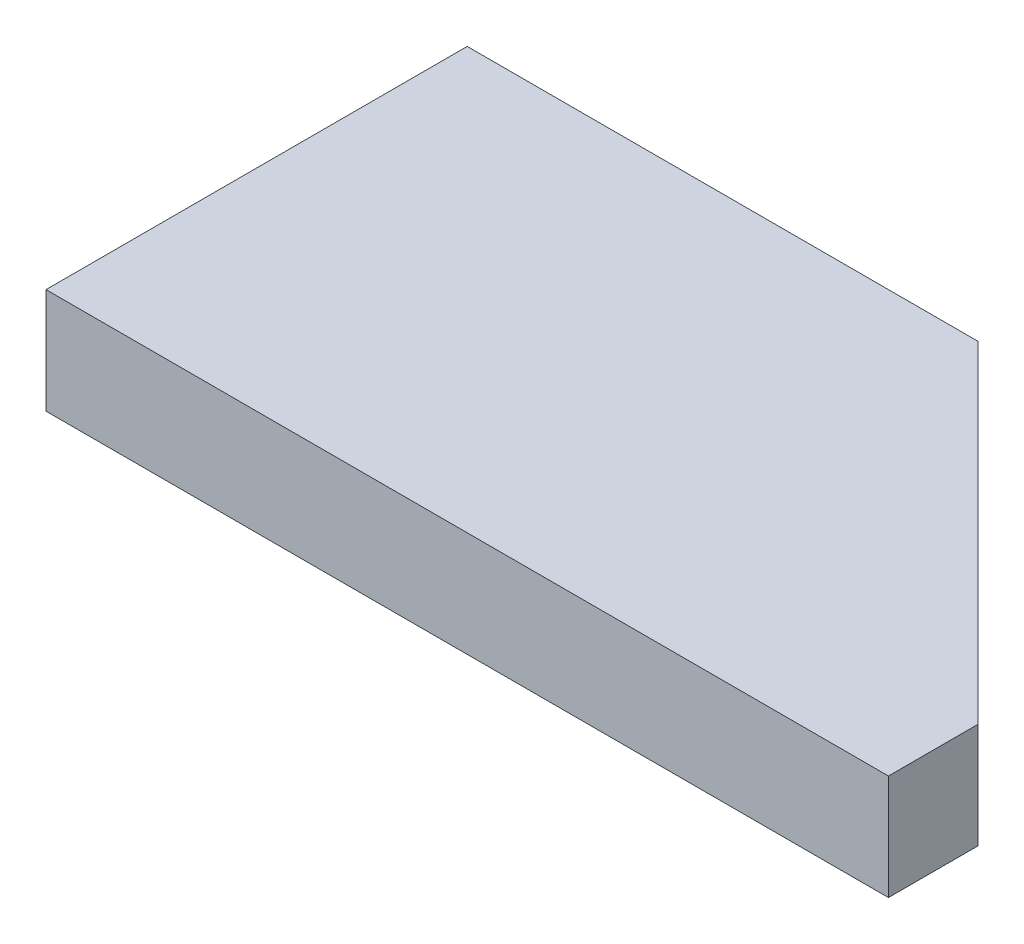
ISO-10303-21;
HEADER;
FILE_DESCRIPTION(('STEP AP214'),'2;1');
FILE_NAME('part.step','',(''),(''),'','','');
FILE_SCHEMA(('AUTOMOTIVE_DESIGN { 1 0 10303 214 1 1 1 1 }'));
ENDSEC;
DATA;
#1=APPLICATION_CONTEXT('core data for automotive mechanical design processes');
#2=APPLICATION_PROTOCOL_DEFINITION('international standard','automotive_design',2000,#1);
#3=PRODUCT_CONTEXT('',#1,'mechanical');
#4=PRODUCT('Part','Part','',(#3));
#5=PRODUCT_RELATED_PRODUCT_CATEGORY('part','',(#4));
#6=PRODUCT_DEFINITION_FORMATION('','',#4);
#7=PRODUCT_DEFINITION_CONTEXT('part definition',#1,'design');
#8=PRODUCT_DEFINITION('design','',#6,#7);
#9=PRODUCT_DEFINITION_SHAPE('','',#8);
#10=(LENGTH_UNIT() NAMED_UNIT(*) SI_UNIT(.MILLI.,.METRE.));
#11=(NAMED_UNIT(*) PLANE_ANGLE_UNIT() SI_UNIT($,.RADIAN.));
#12=(NAMED_UNIT(*) SI_UNIT($,.STERADIAN.) SOLID_ANGLE_UNIT());
#13=UNCERTAINTY_MEASURE_WITH_UNIT(LENGTH_MEASURE(1.E-05),#10,'distance_accuracy_value','');
#14=(GEOMETRIC_REPRESENTATION_CONTEXT(3) GLOBAL_UNCERTAINTY_ASSIGNED_CONTEXT((#13)) GLOBAL_UNIT_ASSIGNED_CONTEXT((#10,
#11,#12)) REPRESENTATION_CONTEXT('',''));
#15=CARTESIAN_POINT('',(0.,0.,0.));
#16=DIRECTION('',(0.,0.,1.));
#17=DIRECTION('',(1.,0.,0.));
#18=AXIS2_PLACEMENT_3D('',#15,#16,#17);
#19=CARTESIAN_POINT('',(0.,3.175,0.));
#20=DIRECTION('',(1.,0.,0.));
#21=DIRECTION('',(0.,0.,-1.));
#22=AXIS2_PLACEMENT_3D('',#19,#20,#21);
#23=PLANE('',#22);
#24=DIRECTION('',(0.,0.,1.));
#25=VECTOR('',#24,1.);
#26=CARTESIAN_POINT('',(0.,0.,0.));
#27=LINE('',#26,#25);
#28=CARTESIAN_POINT('',(0.,0.,-12.7));
#29=VERTEX_POINT('',#28);
#30=CARTESIAN_POINT('',(0.,0.,0.));
#31=VERTEX_POINT('',#30);
#32=EDGE_CURVE('E111',#29,#31,#27,.T.);
#33=ORIENTED_EDGE('',*,*,#32,.T.);
#34=DIRECTION('',(0.,-1.,0.));
#35=VECTOR('',#34,1.);
#36=CARTESIAN_POINT('',(0.,3.175,0.));
#37=LINE('',#36,#35);
#38=CARTESIAN_POINT('',(0.,3.175,0.));
#39=VERTEX_POINT('',#38);
#40=EDGE_CURVE('E93',#39,#31,#37,.T.);
#41=ORIENTED_EDGE('',*,*,#40,.F.);
#42=DIRECTION('',(0.,0.,1.));
#43=VECTOR('',#42,1.);
#44=CARTESIAN_POINT('',(0.,3.175,0.));
#45=LINE('',#44,#43);
#46=CARTESIAN_POINT('',(0.,3.175,-12.7));
#47=VERTEX_POINT('',#46);
#48=EDGE_CURVE('E99',#47,#39,#45,.T.);
#49=ORIENTED_EDGE('',*,*,#48,.F.);
#50=DIRECTION('',(0.,-1.,0.));
#51=VECTOR('',#50,1.);
#52=CARTESIAN_POINT('',(0.,3.175,-12.7));
#53=LINE('',#52,#51);
#54=EDGE_CURVE('E116',#47,#29,#53,.T.);
#55=ORIENTED_EDGE('',*,*,#54,.T.);
#56=EDGE_LOOP('',(#33,#41,#49,#55));
#57=FACE_BOUND('',#56,.T.);
#58=ADVANCED_FACE('F41',(#57),#23,.F.);
#59=CARTESIAN_POINT('',(0.,3.175,0.));
#60=DIRECTION('',(0.,0.,-1.));
#61=DIRECTION('',(-1.,0.,0.));
#62=AXIS2_PLACEMENT_3D('',#59,#60,#61);
#63=PLANE('',#62);
#64=DIRECTION('',(1.,0.,0.));
#65=VECTOR('',#64,1.);
#66=CARTESIAN_POINT('',(0.,0.,0.));
#67=LINE('',#66,#65);
#68=CARTESIAN_POINT('',(25.4,0.,0.));
#69=VERTEX_POINT('',#68);
#70=EDGE_CURVE('E124',#31,#69,#67,.T.);
#71=ORIENTED_EDGE('',*,*,#70,.T.);
#72=DIRECTION('',(0.,-1.,0.));
#73=VECTOR('',#72,1.);
#74=CARTESIAN_POINT('',(25.4,3.175,0.));
#75=LINE('',#74,#73);
#76=CARTESIAN_POINT('',(25.4,3.175,0.));
#77=VERTEX_POINT('',#76);
#78=EDGE_CURVE('E96',#77,#69,#75,.T.);
#79=ORIENTED_EDGE('',*,*,#78,.F.);
#80=DIRECTION('',(1.,0.,0.));
#81=VECTOR('',#80,1.);
#82=CARTESIAN_POINT('',(0.,3.175,0.));
#83=LINE('',#82,#81);
#84=EDGE_CURVE('E89',#39,#77,#83,.T.);
#85=ORIENTED_EDGE('',*,*,#84,.F.);
#86=ORIENTED_EDGE('',*,*,#40,.T.);
#87=EDGE_LOOP('',(#71,#79,#85,#86));
#88=FACE_BOUND('',#87,.T.);
#89=ADVANCED_FACE('F91',(#88),#63,.F.);
#90=CARTESIAN_POINT('',(25.4,3.175,0.));
#91=DIRECTION('',(-1.,0.,0.));
#92=DIRECTION('',(0.,0.,1.));
#93=AXIS2_PLACEMENT_3D('',#90,#91,#92);
#94=PLANE('',#93);
#95=DIRECTION('',(0.,0.,-1.));
#96=VECTOR('',#95,1.);
#97=CARTESIAN_POINT('',(25.4,0.,0.));
#98=LINE('',#97,#96);
#99=CARTESIAN_POINT('',(25.4,0.,-2.69999999999996));
#100=VERTEX_POINT('',#99);
#101=EDGE_CURVE('E122',#69,#100,#98,.T.);
#102=ORIENTED_EDGE('',*,*,#101,.T.);
#103=DIRECTION('',(0.,1.,0.));
#104=VECTOR('',#103,1.);
#105=CARTESIAN_POINT('',(25.4,3.175,-2.69999999999996));
#106=LINE('',#105,#104);
#107=CARTESIAN_POINT('',(25.4,3.175,-2.69999999999996));
#108=VERTEX_POINT('',#107);
#109=EDGE_CURVE('E50',#100,#108,#106,.T.);
#110=ORIENTED_EDGE('',*,*,#109,.T.);
#111=DIRECTION('',(0.,0.,-1.));
#112=VECTOR('',#111,1.);
#113=CARTESIAN_POINT('',(25.4,3.175,0.));
#114=LINE('',#113,#112);
#115=EDGE_CURVE('E98',#77,#108,#114,.T.);
#116=ORIENTED_EDGE('',*,*,#115,.F.);
#117=ORIENTED_EDGE('',*,*,#78,.T.);
#118=EDGE_LOOP('',(#102,#110,#116,#117));
#119=FACE_BOUND('',#118,.T.);
#120=ADVANCED_FACE('F134',(#119),#94,.F.);
#121=CARTESIAN_POINT('',(0.,3.175,-12.7));
#122=DIRECTION('',(0.,0.,1.));
#123=DIRECTION('',(1.,0.,0.));
#124=AXIS2_PLACEMENT_3D('',#121,#122,#123);
#125=PLANE('',#124);
#126=DIRECTION('',(-1.,0.,0.));
#127=VECTOR('',#126,1.);
#128=CARTESIAN_POINT('',(0.,3.175,-12.7));
#129=LINE('',#128,#127);
#130=CARTESIAN_POINT('',(15.4,3.175,-12.7));
#131=VERTEX_POINT('',#130);
#132=EDGE_CURVE('E104',#131,#47,#129,.T.);
#133=ORIENTED_EDGE('',*,*,#132,.F.);
#134=DIRECTION('',(0.,-1.,0.));
#135=VECTOR('',#134,1.);
#136=CARTESIAN_POINT('',(15.4,3.175,-12.7));
#137=LINE('',#136,#135);
#138=CARTESIAN_POINT('',(15.4,0.,-12.7));
#139=VERTEX_POINT('',#138);
#140=EDGE_CURVE('E112',#131,#139,#137,.T.);
#141=ORIENTED_EDGE('',*,*,#140,.T.);
#142=DIRECTION('',(-1.,0.,0.));
#143=VECTOR('',#142,1.);
#144=CARTESIAN_POINT('',(0.,0.,-12.7));
#145=LINE('',#144,#143);
#146=EDGE_CURVE('E108',#139,#29,#145,.T.);
#147=ORIENTED_EDGE('',*,*,#146,.T.);
#148=ORIENTED_EDGE('',*,*,#54,.F.);
#149=EDGE_LOOP('',(#133,#141,#147,#148));
#150=FACE_BOUND('',#149,.T.);
#151=ADVANCED_FACE('F132',(#150),#125,.F.);
#152=CARTESIAN_POINT('',(0.,3.175,0.));
#153=DIRECTION('',(0.,-1.,0.));
#154=DIRECTION('',(0.,0.,-1.));
#155=AXIS2_PLACEMENT_3D('',#152,#153,#154);
#156=PLANE('',#155);
#157=ORIENTED_EDGE('',*,*,#115,.T.);
#158=DIRECTION('',(0.707106781186546,0.,0.707106781186549));
#159=VECTOR('',#158,1.);
#160=CARTESIAN_POINT('',(15.4,3.175,-12.7));
#161=LINE('',#160,#159);
#162=EDGE_CURVE('E11',#108,#131,#161,.F.);
#163=ORIENTED_EDGE('',*,*,#162,.T.);
#164=ORIENTED_EDGE('',*,*,#132,.T.);
#165=ORIENTED_EDGE('',*,*,#48,.T.);
#166=ORIENTED_EDGE('',*,*,#84,.T.);
#167=EDGE_LOOP('',(#157,#163,#164,#165,#166));
#168=FACE_BOUND('',#167,.T.);
#169=ADVANCED_FACE('F102',(#168),#156,.F.);
#170=CARTESIAN_POINT('',(0.,0.,0.));
#171=DIRECTION('',(0.,-1.,0.));
#172=DIRECTION('',(0.,0.,-1.));
#173=AXIS2_PLACEMENT_3D('',#170,#171,#172);
#174=PLANE('',#173);
#175=ORIENTED_EDGE('',*,*,#146,.F.);
#176=DIRECTION('',(-0.707106781186546,0.,-0.707106781186549));
#177=VECTOR('',#176,1.);
#178=CARTESIAN_POINT('',(14.05,0.,-14.05));
#179=LINE('',#178,#177);
#180=EDGE_CURVE('E64',#139,#100,#179,.F.);
#181=ORIENTED_EDGE('',*,*,#180,.T.);
#182=ORIENTED_EDGE('',*,*,#101,.F.);
#183=ORIENTED_EDGE('',*,*,#70,.F.);
#184=ORIENTED_EDGE('',*,*,#32,.F.);
#185=EDGE_LOOP('',(#175,#181,#182,#183,#184));
#186=FACE_BOUND('',#185,.T.);
#187=ADVANCED_FACE('F133',(#186),#174,.T.);
#188=CARTESIAN_POINT('',(15.4,3.175,-12.7));
#189=DIRECTION('',(-0.707106781186549,0.,0.707106781186546));
#190=DIRECTION('',(0.,-1.,0.));
#191=AXIS2_PLACEMENT_3D('',#188,#189,#190);
#192=PLANE('',#191);
#193=ORIENTED_EDGE('',*,*,#162,.F.);
#194=ORIENTED_EDGE('',*,*,#109,.F.);
#195=ORIENTED_EDGE('',*,*,#180,.F.);
#196=ORIENTED_EDGE('',*,*,#140,.F.);
#197=EDGE_LOOP('',(#193,#194,#195,#196));
#198=FACE_BOUND('',#197,.T.);
#199=ADVANCED_FACE('F44',(#198),#192,.F.);
#200=CLOSED_SHELL('',(#58,#89,#120,#151,#169,#187,#199));
#201=MANIFOLD_SOLID_BREP('B2',#200);
#202=ADVANCED_BREP_SHAPE_REPRESENTATION('',(#18,#201),#14);
#203=SHAPE_DEFINITION_REPRESENTATION(#9,#202);
ENDSEC;
END-ISO-10303-21;
